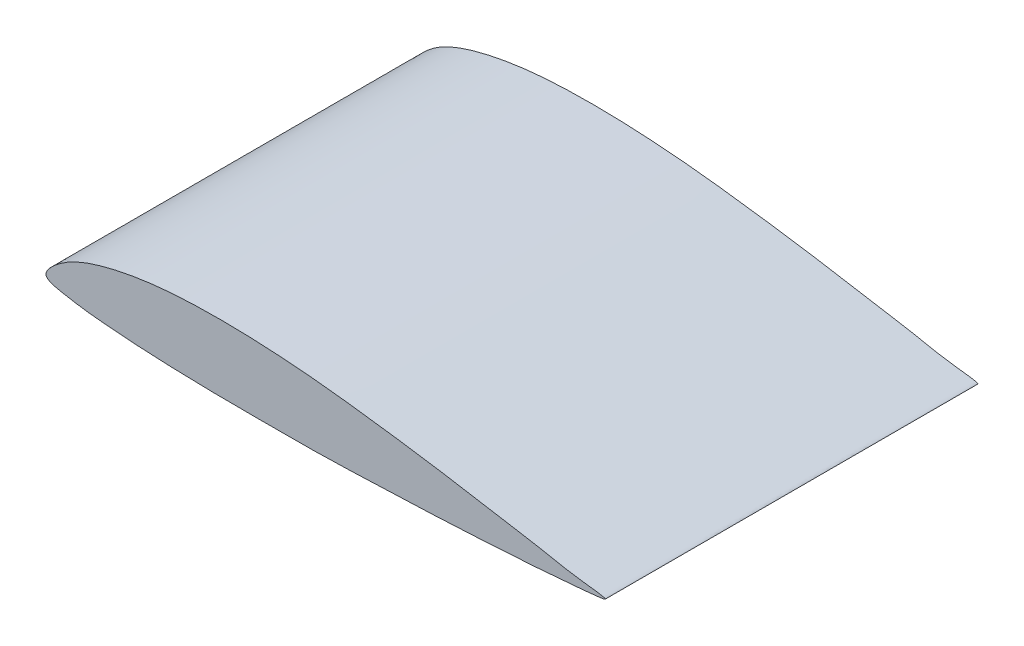
ISO-10303-21;
HEADER;
FILE_DESCRIPTION(('STEP AP214'),'2;1');
FILE_NAME('part.step','',(''),(''),'','','');
FILE_SCHEMA(('AUTOMOTIVE_DESIGN { 1 0 10303 214 1 1 1 1 }'));
ENDSEC;
DATA;
#1=APPLICATION_CONTEXT('core data for automotive mechanical design processes');
#2=APPLICATION_PROTOCOL_DEFINITION('international standard','automotive_design',2000,#1);
#3=PRODUCT_CONTEXT('',#1,'mechanical');
#4=PRODUCT('Part','Part','',(#3));
#5=PRODUCT_RELATED_PRODUCT_CATEGORY('part','',(#4));
#6=PRODUCT_DEFINITION_FORMATION('','',#4);
#7=PRODUCT_DEFINITION_CONTEXT('part definition',#1,'design');
#8=PRODUCT_DEFINITION('design','',#6,#7);
#9=PRODUCT_DEFINITION_SHAPE('','',#8);
#10=(LENGTH_UNIT() NAMED_UNIT(*) SI_UNIT(.MILLI.,.METRE.));
#11=(NAMED_UNIT(*) PLANE_ANGLE_UNIT() SI_UNIT($,.RADIAN.));
#12=(NAMED_UNIT(*) SI_UNIT($,.STERADIAN.) SOLID_ANGLE_UNIT());
#13=UNCERTAINTY_MEASURE_WITH_UNIT(LENGTH_MEASURE(1.E-05),#10,'distance_accuracy_value','');
#14=(GEOMETRIC_REPRESENTATION_CONTEXT(3) GLOBAL_UNCERTAINTY_ASSIGNED_CONTEXT((#13)) GLOBAL_UNIT_ASSIGNED_CONTEXT((#10,
#11,#12)) REPRESENTATION_CONTEXT('',''));
#15=CARTESIAN_POINT('',(0.,0.,0.));
#16=DIRECTION('',(0.,0.,1.));
#17=DIRECTION('',(1.,0.,0.));
#18=AXIS2_PLACEMENT_3D('',#15,#16,#17);
#19=CARTESIAN_POINT('',(150.,0.,100.));
#20=CARTESIAN_POINT('',(150.008053425272,0.372974039983415,100.));
#21=CARTESIAN_POINT('',(141.345567832436,1.16688771757076,100.));
#22=CARTESIAN_POINT('',(133.169926282611,3.03144041657773,100.));
#23=CARTESIAN_POINT('',(119.777902197769,5.12660253637258,100.));
#24=CARTESIAN_POINT('',(105.089952049119,7.74269608991023,100.));
#25=CARTESIAN_POINT('',(90.0029670537944,9.87039420891936,100.));
#26=CARTESIAN_POINT('',(75.0385119162648,11.7968188400122,100.));
#27=CARTESIAN_POINT('',(60.0203536946591,13.0336294582457,100.));
#28=CARTESIAN_POINT('',(44.9994315304977,13.4613587533153,100.));
#29=CARTESIAN_POINT('',(32.4499534492329,12.9596836128883,100.));
#30=CARTESIAN_POINT('',(22.4506333978596,11.584243585388,100.));
#31=CARTESIAN_POINT('',(16.17595826324,10.2053718908448,100.));
#32=CARTESIAN_POINT('',(11.2143675669526,8.69312257593242,100.));
#33=CARTESIAN_POINT('',(7.27133069789492,7.08223973278685,100.));
#34=CARTESIAN_POINT('',(3.57694045024179,4.97132830267792,100.));
#35=CARTESIAN_POINT('',(-2.29568936433638,-0.185353367957695,100.));
#36=CARTESIAN_POINT('',(3.94718611031144,-1.66524123159621,100.));
#37=CARTESIAN_POINT('',(7.41578649216798,-2.24583726718484,100.));
#38=CARTESIAN_POINT('',(11.2584827819809,-2.82994825177532,100.));
#39=CARTESIAN_POINT('',(16.2355724406086,-3.27953154759976,100.));
#40=CARTESIAN_POINT('',(22.4970133918063,-3.8014499998558,100.));
#41=CARTESIAN_POINT('',(32.4917070122907,-4.34172271509206,100.));
#42=CARTESIAN_POINT('',(44.9985271570342,-4.68793247911106,100.));
#43=CARTESIAN_POINT('',(59.9983008918156,-4.69550423673832,100.));
#44=CARTESIAN_POINT('',(75.0095907683236,-4.70005060478897,100.));
#45=CARTESIAN_POINT('',(89.9848880257508,-4.04380574442282,100.));
#46=CARTESIAN_POINT('',(105.063655312747,-3.51422294395867,100.));
#47=CARTESIAN_POINT('',(119.788434235766,-2.68799678192064,100.));
#48=CARTESIAN_POINT('',(133.14796255202,-1.83262071193654,100.));
#49=CARTESIAN_POINT('',(141.401997201694,-1.06645022835423,100.));
#50=CARTESIAN_POINT('',(149.991978739587,-0.371484405837352,100.));
#51=CARTESIAN_POINT('',(150.,0.,100.));
#52=B_SPLINE_CURVE_WITH_KNOTS('',3,(#19,#20,#21,#22,#23,#24,#25,#26,#27,#28,#29,#30,#31,#32,#33,
#34,#35,#36,#37,#38,#39,#40,#41,#42,#43,#44,#45,#46,#47,#48,#49,#50,#51),.UNSPECIFIED.,.T.,.F.,
(4,1,1,1,1,1,1,1,1,1,1,1,1,1,1,1,1,1,1,1,1,1,1,1,1,1,1,1,1,1,4),(0.,0.0248717166383153,
0.0498257500952447,0.0996740549432322,0.149481081914914,0.199113443346739,0.248602294049069,
0.297881851654466,0.347017138154309,0.396197185375596,0.420996042615194,0.446163990129153,
0.459027460665803,0.472308503351641,0.486628938458311,0.506691321782002,0.520010096324818,
0.532487113053283,0.544893447238815,0.557234364661715,0.581872172812346,0.606469995313445,
0.655609332569026,0.704728633737161,0.753848524318639,0.802997287494972,0.852155253927688,
0.901345504030603,0.950577622648266,0.97522761938619,1.),.UNSPECIFIED.);
#53=DIRECTION('',(0.,0.,-1.));
#54=VECTOR('',#53,1.);
#55=SURFACE_OF_LINEAR_EXTRUSION('',#52,#54);
#56=CARTESIAN_POINT('',(150.,0.,100.));
#57=VERTEX_POINT('',#56);
#58=EDGE_CURVE('E10',#57,#57,#52,.T.);
#59=ORIENTED_EDGE('',*,*,#58,.F.);
#60=EDGE_LOOP('',(#59));
#61=FACE_BOUND('',#60,.T.);
#62=CARTESIAN_POINT('',(150.,0.,0.));
#63=CARTESIAN_POINT('',(150.008053425272,0.372974039983415,0.));
#64=CARTESIAN_POINT('',(141.345567832436,1.16688771757076,0.));
#65=CARTESIAN_POINT('',(133.169926282611,3.03144041657773,0.));
#66=CARTESIAN_POINT('',(119.777902197769,5.12660253637258,0.));
#67=CARTESIAN_POINT('',(105.089952049119,7.74269608991023,0.));
#68=CARTESIAN_POINT('',(90.0029670537944,9.87039420891936,0.));
#69=CARTESIAN_POINT('',(75.0385119162648,11.7968188400122,0.));
#70=CARTESIAN_POINT('',(60.0203536946591,13.0336294582457,0.));
#71=CARTESIAN_POINT('',(44.9994315304977,13.4613587533153,0.));
#72=CARTESIAN_POINT('',(32.4499534492329,12.9596836128883,0.));
#73=CARTESIAN_POINT('',(22.4506333978596,11.584243585388,0.));
#74=CARTESIAN_POINT('',(16.17595826324,10.2053718908448,0.));
#75=CARTESIAN_POINT('',(11.2143675669526,8.69312257593242,0.));
#76=CARTESIAN_POINT('',(7.27133069789492,7.08223973278685,0.));
#77=CARTESIAN_POINT('',(3.57694045024179,4.97132830267792,0.));
#78=CARTESIAN_POINT('',(-2.29568936433638,-0.185353367957695,0.));
#79=CARTESIAN_POINT('',(3.94718611031144,-1.66524123159621,0.));
#80=CARTESIAN_POINT('',(7.41578649216798,-2.24583726718484,0.));
#81=CARTESIAN_POINT('',(11.2584827819809,-2.82994825177532,0.));
#82=CARTESIAN_POINT('',(16.2355724406086,-3.27953154759976,0.));
#83=CARTESIAN_POINT('',(22.4970133918063,-3.8014499998558,0.));
#84=CARTESIAN_POINT('',(32.4917070122907,-4.34172271509206,0.));
#85=CARTESIAN_POINT('',(44.9985271570342,-4.68793247911106,0.));
#86=CARTESIAN_POINT('',(59.9983008918156,-4.69550423673832,0.));
#87=CARTESIAN_POINT('',(75.0095907683236,-4.70005060478897,0.));
#88=CARTESIAN_POINT('',(89.9848880257508,-4.04380574442282,0.));
#89=CARTESIAN_POINT('',(105.063655312747,-3.51422294395867,0.));
#90=CARTESIAN_POINT('',(119.788434235766,-2.68799678192064,0.));
#91=CARTESIAN_POINT('',(133.14796255202,-1.83262071193654,0.));
#92=CARTESIAN_POINT('',(141.401997201694,-1.06645022835423,0.));
#93=CARTESIAN_POINT('',(149.991978739587,-0.371484405837352,0.));
#94=CARTESIAN_POINT('',(150.,0.,0.));
#95=B_SPLINE_CURVE_WITH_KNOTS('',3,(#62,#63,#64,#65,#66,#67,#68,#69,#70,#71,#72,#73,#74,#75,#76,
#77,#78,#79,#80,#81,#82,#83,#84,#85,#86,#87,#88,#89,#90,#91,#92,#93,#94),.UNSPECIFIED.,.T.,.F.,
(4,1,1,1,1,1,1,1,1,1,1,1,1,1,1,1,1,1,1,1,1,1,1,1,1,1,1,1,1,1,4),(0.,0.0248717166383153,
0.0498257500952447,0.0996740549432322,0.149481081914914,0.199113443346739,0.248602294049069,
0.297881851654466,0.347017138154309,0.396197185375596,0.420996042615194,0.446163990129153,
0.459027460665803,0.472308503351641,0.486628938458311,0.506691321782002,0.520010096324818,
0.532487113053283,0.544893447238815,0.557234364661715,0.581872172812346,0.606469995313445,
0.655609332569026,0.704728633737161,0.753848524318639,0.802997287494972,0.852155253927688,
0.901345504030603,0.950577622648266,0.97522761938619,1.),.UNSPECIFIED.);
#96=CARTESIAN_POINT('',(150.,0.,0.));
#97=VERTEX_POINT('',#96);
#98=EDGE_CURVE('E43',#97,#97,#95,.T.);
#99=ORIENTED_EDGE('',*,*,#98,.T.);
#100=EDGE_LOOP('',(#99));
#101=FACE_BOUND('',#100,.T.);
#102=ADVANCED_FACE('F39',(#61,#101),#55,.F.);
#103=CARTESIAN_POINT('',(0.251021816108468,1.49866681209946,100.));
#104=DIRECTION('',(0.,0.,-1.));
#105=DIRECTION('',(-1.,0.,0.));
#106=AXIS2_PLACEMENT_3D('',#103,#104,#105);
#107=PLANE('',#106);
#108=ORIENTED_EDGE('',*,*,#58,.T.);
#109=EDGE_LOOP('',(#108));
#110=FACE_BOUND('',#109,.T.);
#111=ADVANCED_FACE('F62',(#110),#107,.F.);
#112=CARTESIAN_POINT('',(0.251021816108468,1.49866681209946,0.));
#113=DIRECTION('',(0.,0.,-1.));
#114=DIRECTION('',(-1.,0.,0.));
#115=AXIS2_PLACEMENT_3D('',#112,#113,#114);
#116=PLANE('',#115);
#117=ORIENTED_EDGE('',*,*,#98,.F.);
#118=EDGE_LOOP('',(#117));
#119=FACE_BOUND('',#118,.T.);
#120=ADVANCED_FACE('F60',(#119),#116,.T.);
#121=CLOSED_SHELL('',(#102,#111,#120));
#122=MANIFOLD_SOLID_BREP('B2',#121);
#123=ADVANCED_BREP_SHAPE_REPRESENTATION('',(#18,#122),#14);
#124=SHAPE_DEFINITION_REPRESENTATION(#9,#123);
ENDSEC;
END-ISO-10303-21;
